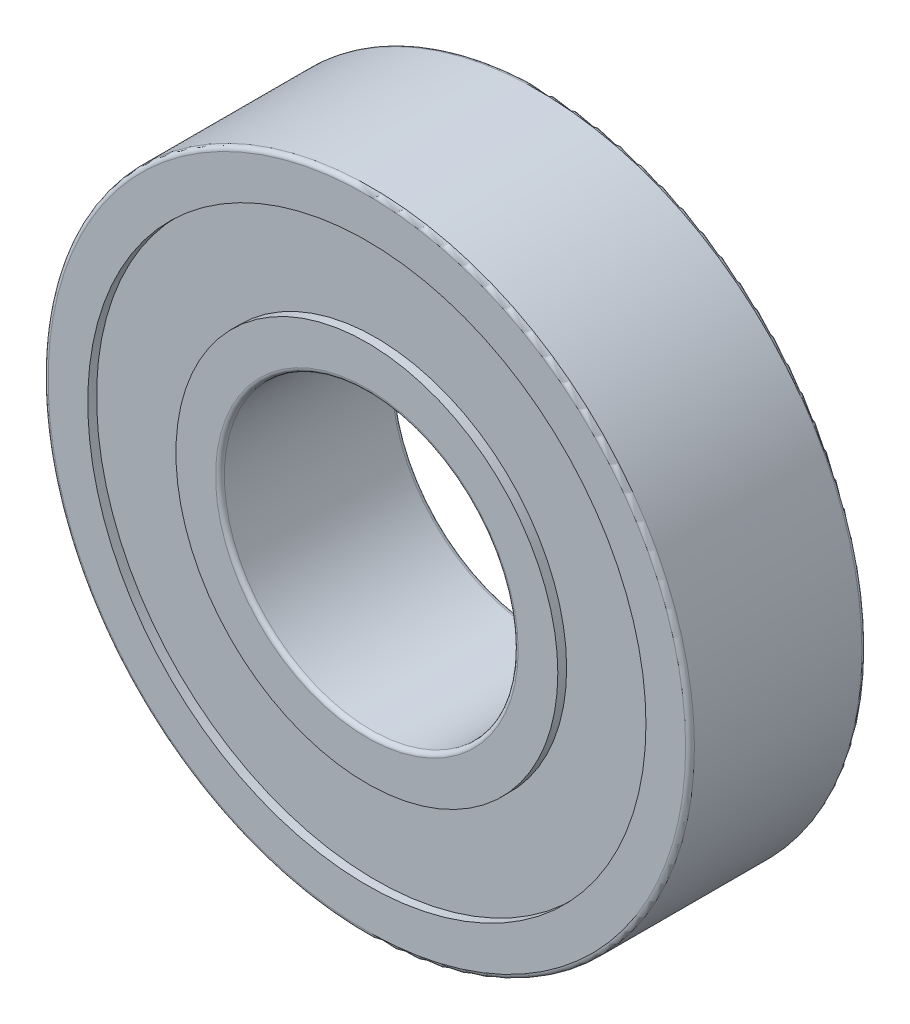
ISO-10303-21;
HEADER;
FILE_DESCRIPTION(('STEP AP214'),'2;1');
FILE_NAME('part.step','',(''),(''),'','','');
FILE_SCHEMA(('AUTOMOTIVE_DESIGN { 1 0 10303 214 1 1 1 1 }'));
ENDSEC;
DATA;
#1=APPLICATION_CONTEXT('core data for automotive mechanical design processes');
#2=APPLICATION_PROTOCOL_DEFINITION('international standard','automotive_design',2000,#1);
#3=PRODUCT_CONTEXT('',#1,'mechanical');
#4=PRODUCT('Part','Part','',(#3));
#5=PRODUCT_RELATED_PRODUCT_CATEGORY('part','',(#4));
#6=PRODUCT_DEFINITION_FORMATION('','',#4);
#7=PRODUCT_DEFINITION_CONTEXT('part definition',#1,'design');
#8=PRODUCT_DEFINITION('design','',#6,#7);
#9=PRODUCT_DEFINITION_SHAPE('','',#8);
#10=(LENGTH_UNIT() NAMED_UNIT(*) SI_UNIT(.MILLI.,.METRE.));
#11=(NAMED_UNIT(*) PLANE_ANGLE_UNIT() SI_UNIT($,.RADIAN.));
#12=(NAMED_UNIT(*) SI_UNIT($,.STERADIAN.) SOLID_ANGLE_UNIT());
#13=UNCERTAINTY_MEASURE_WITH_UNIT(LENGTH_MEASURE(1.E-05),#10,'distance_accuracy_value','');
#14=(GEOMETRIC_REPRESENTATION_CONTEXT(3) GLOBAL_UNCERTAINTY_ASSIGNED_CONTEXT((#13)) GLOBAL_UNIT_ASSIGNED_CONTEXT((#10,
#11,#12)) REPRESENTATION_CONTEXT('',''));
#15=CARTESIAN_POINT('',(0.,0.,0.));
#16=DIRECTION('',(0.,0.,1.));
#17=DIRECTION('',(1.,0.,0.));
#18=AXIS2_PLACEMENT_3D('',#15,#16,#17);
#19=CARTESIAN_POINT('',(0.,0.,0.));
#20=DIRECTION('',(0.,0.,1.));
#21=DIRECTION('',(1.,0.,0.));
#22=AXIS2_PLACEMENT_3D('',#19,#20,#21);
#23=PLANE('',#22);
#24=CARTESIAN_POINT('',(0.,0.,0.));
#25=DIRECTION('',(0.,0.,1.));
#26=DIRECTION('',(1.,0.,0.));
#27=AXIS2_PLACEMENT_3D('',#24,#25,#26);
#28=CIRCLE('',#27,5.15);
#29=CARTESIAN_POINT('',(5.15,0.,0.));
#30=VERTEX_POINT('',#29);
#31=EDGE_CURVE('E61',#30,#30,#28,.T.);
#32=ORIENTED_EDGE('',*,*,#31,.T.);
#33=EDGE_LOOP('',(#32));
#34=FACE_BOUND('',#33,.T.);
#35=CARTESIAN_POINT('',(0.,0.,0.));
#36=DIRECTION('',(0.,0.,1.));
#37=DIRECTION('',(1.,0.,0.));
#38=AXIS2_PLACEMENT_3D('',#35,#36,#37);
#39=CIRCLE('',#38,6.5);
#40=CARTESIAN_POINT('',(6.5,0.,0.));
#41=VERTEX_POINT('',#40);
#42=EDGE_CURVE('E83',#41,#41,#39,.T.);
#43=ORIENTED_EDGE('',*,*,#42,.F.);
#44=EDGE_LOOP('',(#43));
#45=FACE_BOUND('',#44,.T.);
#46=ADVANCED_FACE('F32',(#34,#45),#23,.F.);
#47=CARTESIAN_POINT('',(0.,0.,6.));
#48=DIRECTION('',(0.,0.,1.));
#49=DIRECTION('',(1.,0.,0.));
#50=AXIS2_PLACEMENT_3D('',#47,#48,#49);
#51=PLANE('',#50);
#52=CARTESIAN_POINT('',(0.,0.,6.));
#53=DIRECTION('',(0.,0.,1.));
#54=DIRECTION('',(1.,0.,0.));
#55=AXIS2_PLACEMENT_3D('',#52,#53,#54);
#56=CIRCLE('',#55,5.15);
#57=CARTESIAN_POINT('',(5.15,0.,6.));
#58=VERTEX_POINT('',#57);
#59=EDGE_CURVE('E39',#58,#58,#56,.F.);
#60=ORIENTED_EDGE('',*,*,#59,.T.);
#61=EDGE_LOOP('',(#60));
#62=FACE_BOUND('',#61,.T.);
#63=CARTESIAN_POINT('',(0.,0.,6.));
#64=DIRECTION('',(0.,0.,1.));
#65=DIRECTION('',(1.,0.,0.));
#66=AXIS2_PLACEMENT_3D('',#63,#64,#65);
#67=CIRCLE('',#66,6.5);
#68=CARTESIAN_POINT('',(6.5,0.,6.));
#69=VERTEX_POINT('',#68);
#70=EDGE_CURVE('E71',#69,#69,#67,.T.);
#71=ORIENTED_EDGE('',*,*,#70,.T.);
#72=EDGE_LOOP('',(#71));
#73=FACE_BOUND('',#72,.T.);
#74=ADVANCED_FACE('F100',(#62,#73),#51,.T.);
#75=CARTESIAN_POINT('',(0.,0.,6.));
#76=DIRECTION('',(0.,0.,1.));
#77=DIRECTION('',(1.,0.,0.));
#78=AXIS2_PLACEMENT_3D('',#75,#76,#77);
#79=CIRCLE('',#78,10.85);
#80=CARTESIAN_POINT('',(10.85,0.,6.));
#81=VERTEX_POINT('',#80);
#82=EDGE_CURVE('E10',#81,#81,#79,.T.);
#83=ORIENTED_EDGE('',*,*,#82,.T.);
#84=EDGE_LOOP('',(#83));
#85=FACE_BOUND('',#84,.T.);
#86=CARTESIAN_POINT('',(0.,0.,6.));
#87=DIRECTION('',(0.,0.,1.));
#88=DIRECTION('',(1.,0.,0.));
#89=AXIS2_PLACEMENT_3D('',#86,#87,#88);
#90=CIRCLE('',#89,9.5);
#91=CARTESIAN_POINT('',(9.5,0.,6.));
#92=VERTEX_POINT('',#91);
#93=EDGE_CURVE('E65',#92,#92,#90,.T.);
#94=ORIENTED_EDGE('',*,*,#93,.F.);
#95=EDGE_LOOP('',(#94));
#96=FACE_BOUND('',#95,.T.);
#97=ADVANCED_FACE('F107',(#85,#96),#51,.T.);
#98=CARTESIAN_POINT('',(0.,0.,0.));
#99=DIRECTION('',(0.,0.,1.));
#100=DIRECTION('',(1.,0.,0.));
#101=AXIS2_PLACEMENT_3D('',#98,#99,#100);
#102=CIRCLE('',#101,10.85);
#103=CARTESIAN_POINT('',(10.85,0.,0.));
#104=VERTEX_POINT('',#103);
#105=EDGE_CURVE('E43',#104,#104,#102,.F.);
#106=ORIENTED_EDGE('',*,*,#105,.T.);
#107=EDGE_LOOP('',(#106));
#108=FACE_BOUND('',#107,.T.);
#109=CARTESIAN_POINT('',(0.,0.,0.));
#110=DIRECTION('',(0.,0.,1.));
#111=DIRECTION('',(1.,0.,0.));
#112=AXIS2_PLACEMENT_3D('',#109,#110,#111);
#113=CIRCLE('',#112,9.5);
#114=CARTESIAN_POINT('',(9.5,0.,0.));
#115=VERTEX_POINT('',#114);
#116=EDGE_CURVE('E77',#115,#115,#113,.T.);
#117=ORIENTED_EDGE('',*,*,#116,.T.);
#118=EDGE_LOOP('',(#117));
#119=FACE_BOUND('',#118,.T.);
#120=ADVANCED_FACE('F103',(#108,#119),#23,.F.);
#121=CARTESIAN_POINT('',(0.,0.,6.));
#122=DIRECTION('',(0.,0.,-1.));
#123=DIRECTION('',(-1.,0.,0.));
#124=AXIS2_PLACEMENT_3D('',#121,#122,#123);
#125=CYLINDRICAL_SURFACE('',#124,11.);
#126=CARTESIAN_POINT('',(0.,0.,0.15));
#127=DIRECTION('',(0.,0.,1.));
#128=DIRECTION('',(1.,0.,0.));
#129=AXIS2_PLACEMENT_3D('',#126,#127,#128);
#130=CIRCLE('',#129,11.);
#131=CARTESIAN_POINT('',(11.,0.,0.15));
#132=VERTEX_POINT('',#131);
#133=EDGE_CURVE('E47',#132,#132,#130,.T.);
#134=ORIENTED_EDGE('',*,*,#133,.T.);
#135=EDGE_LOOP('',(#134));
#136=FACE_BOUND('',#135,.T.);
#137=CARTESIAN_POINT('',(0.,0.,5.85));
#138=DIRECTION('',(0.,0.,1.));
#139=DIRECTION('',(1.,0.,0.));
#140=AXIS2_PLACEMENT_3D('',#137,#138,#139);
#141=CIRCLE('',#140,11.);
#142=CARTESIAN_POINT('',(11.,0.,5.85));
#143=VERTEX_POINT('',#142);
#144=EDGE_CURVE('E52',#143,#143,#141,.F.);
#145=ORIENTED_EDGE('',*,*,#144,.T.);
#146=EDGE_LOOP('',(#145));
#147=FACE_BOUND('',#146,.T.);
#148=ADVANCED_FACE('F111',(#136,#147),#125,.T.);
#149=CARTESIAN_POINT('',(0.,0.,6.));
#150=DIRECTION('',(0.,0.,-1.));
#151=DIRECTION('',(-1.,0.,0.));
#152=AXIS2_PLACEMENT_3D('',#149,#150,#151);
#153=CYLINDRICAL_SURFACE('',#152,5.);
#154=CARTESIAN_POINT('',(0.,0.,0.15));
#155=DIRECTION('',(0.,0.,1.));
#156=DIRECTION('',(1.,0.,0.));
#157=AXIS2_PLACEMENT_3D('',#154,#155,#156);
#158=CIRCLE('',#157,5.);
#159=CARTESIAN_POINT('',(5.,0.,0.15));
#160=VERTEX_POINT('',#159);
#161=EDGE_CURVE('E55',#160,#160,#158,.F.);
#162=ORIENTED_EDGE('',*,*,#161,.T.);
#163=EDGE_LOOP('',(#162));
#164=FACE_BOUND('',#163,.T.);
#165=CARTESIAN_POINT('',(0.,0.,5.85));
#166=DIRECTION('',(0.,0.,1.));
#167=DIRECTION('',(1.,0.,0.));
#168=AXIS2_PLACEMENT_3D('',#165,#166,#167);
#169=CIRCLE('',#168,5.);
#170=CARTESIAN_POINT('',(5.,0.,5.85));
#171=VERTEX_POINT('',#170);
#172=EDGE_CURVE('E58',#171,#171,#169,.T.);
#173=ORIENTED_EDGE('',*,*,#172,.T.);
#174=EDGE_LOOP('',(#173));
#175=FACE_BOUND('',#174,.T.);
#176=ADVANCED_FACE('F117',(#164,#175),#153,.F.);
#177=CARTESIAN_POINT('',(0.,0.,5.7));
#178=DIRECTION('',(0.,0.,1.));
#179=DIRECTION('',(1.,0.,0.));
#180=AXIS2_PLACEMENT_3D('',#177,#178,#179);
#181=CYLINDRICAL_SURFACE('',#180,9.5);
#182=CARTESIAN_POINT('',(0.,0.,5.7));
#183=DIRECTION('',(0.,0.,1.));
#184=DIRECTION('',(1.,0.,0.));
#185=AXIS2_PLACEMENT_3D('',#182,#183,#184);
#186=CIRCLE('',#185,9.5);
#187=CARTESIAN_POINT('',(9.5,0.,5.7));
#188=VERTEX_POINT('',#187);
#189=EDGE_CURVE('E64',#188,#188,#186,.T.);
#190=ORIENTED_EDGE('',*,*,#189,.F.);
#191=EDGE_LOOP('',(#190));
#192=FACE_BOUND('',#191,.T.);
#193=ORIENTED_EDGE('',*,*,#93,.T.);
#194=EDGE_LOOP('',(#193));
#195=FACE_BOUND('',#194,.T.);
#196=ADVANCED_FACE('F139',(#192,#195),#181,.F.);
#197=CARTESIAN_POINT('',(0.,0.,5.7));
#198=DIRECTION('',(0.,0.,1.));
#199=DIRECTION('',(1.,0.,0.));
#200=AXIS2_PLACEMENT_3D('',#197,#198,#199);
#201=PLANE('',#200);
#202=CARTESIAN_POINT('',(0.,0.,5.7));
#203=DIRECTION('',(0.,0.,1.));
#204=DIRECTION('',(1.,0.,0.));
#205=AXIS2_PLACEMENT_3D('',#202,#203,#204);
#206=CIRCLE('',#205,6.5);
#207=CARTESIAN_POINT('',(6.5,0.,5.7));
#208=VERTEX_POINT('',#207);
#209=EDGE_CURVE('E68',#208,#208,#206,.T.);
#210=ORIENTED_EDGE('',*,*,#209,.F.);
#211=EDGE_LOOP('',(#210));
#212=FACE_BOUND('',#211,.T.);
#213=ORIENTED_EDGE('',*,*,#189,.T.);
#214=EDGE_LOOP('',(#213));
#215=FACE_BOUND('',#214,.T.);
#216=ADVANCED_FACE('F135',(#212,#215),#201,.T.);
#217=CARTESIAN_POINT('',(0.,0.,5.7));
#218=DIRECTION('',(0.,0.,1.));
#219=DIRECTION('',(1.,0.,0.));
#220=AXIS2_PLACEMENT_3D('',#217,#218,#219);
#221=CYLINDRICAL_SURFACE('',#220,6.5);
#222=ORIENTED_EDGE('',*,*,#209,.T.);
#223=EDGE_LOOP('',(#222));
#224=FACE_BOUND('',#223,.T.);
#225=ORIENTED_EDGE('',*,*,#70,.F.);
#226=EDGE_LOOP('',(#225));
#227=FACE_BOUND('',#226,.T.);
#228=ADVANCED_FACE('F129',(#224,#227),#221,.T.);
#229=CARTESIAN_POINT('',(0.,0.,0.5));
#230=DIRECTION('',(0.,0.,1.));
#231=DIRECTION('',(1.,0.,0.));
#232=AXIS2_PLACEMENT_3D('',#229,#230,#231);
#233=PLANE('',#232);
#234=CARTESIAN_POINT('',(0.,0.,0.5));
#235=DIRECTION('',(0.,0.,1.));
#236=DIRECTION('',(1.,0.,0.));
#237=AXIS2_PLACEMENT_3D('',#234,#235,#236);
#238=CIRCLE('',#237,9.5);
#239=CARTESIAN_POINT('',(9.5,0.,0.5));
#240=VERTEX_POINT('',#239);
#241=EDGE_CURVE('E74',#240,#240,#238,.T.);
#242=ORIENTED_EDGE('',*,*,#241,.F.);
#243=EDGE_LOOP('',(#242));
#244=FACE_BOUND('',#243,.T.);
#245=CARTESIAN_POINT('',(0.,0.,0.5));
#246=DIRECTION('',(0.,0.,1.));
#247=DIRECTION('',(1.,0.,0.));
#248=AXIS2_PLACEMENT_3D('',#245,#246,#247);
#249=CIRCLE('',#248,6.5);
#250=CARTESIAN_POINT('',(6.5,0.,0.5));
#251=VERTEX_POINT('',#250);
#252=EDGE_CURVE('E80',#251,#251,#249,.T.);
#253=ORIENTED_EDGE('',*,*,#252,.T.);
#254=EDGE_LOOP('',(#253));
#255=FACE_BOUND('',#254,.T.);
#256=ADVANCED_FACE('F89',(#244,#255),#233,.F.);
#257=CARTESIAN_POINT('',(0.,0.,0.5));
#258=DIRECTION('',(0.,0.,-1.));
#259=DIRECTION('',(-1.,0.,0.));
#260=AXIS2_PLACEMENT_3D('',#257,#258,#259);
#261=CYLINDRICAL_SURFACE('',#260,9.5);
#262=ORIENTED_EDGE('',*,*,#241,.T.);
#263=EDGE_LOOP('',(#262));
#264=FACE_BOUND('',#263,.T.);
#265=ORIENTED_EDGE('',*,*,#116,.F.);
#266=EDGE_LOOP('',(#265));
#267=FACE_BOUND('',#266,.T.);
#268=ADVANCED_FACE('F95',(#264,#267),#261,.F.);
#269=CARTESIAN_POINT('',(0.,0.,0.5));
#270=DIRECTION('',(0.,0.,-1.));
#271=DIRECTION('',(-1.,0.,0.));
#272=AXIS2_PLACEMENT_3D('',#269,#270,#271);
#273=CYLINDRICAL_SURFACE('',#272,6.5);
#274=ORIENTED_EDGE('',*,*,#252,.F.);
#275=EDGE_LOOP('',(#274));
#276=FACE_BOUND('',#275,.T.);
#277=ORIENTED_EDGE('',*,*,#42,.T.);
#278=EDGE_LOOP('',(#277));
#279=FACE_BOUND('',#278,.T.);
#280=ADVANCED_FACE('F91',(#276,#279),#273,.T.);
#281=CARTESIAN_POINT('',(0.,0.,0.15));
#282=DIRECTION('',(0.,0.,1.));
#283=DIRECTION('',(1.,0.,0.));
#284=AXIS2_PLACEMENT_3D('',#281,#282,#283);
#285=TOROIDAL_SURFACE('',#284,5.15,0.15);
#286=ORIENTED_EDGE('',*,*,#161,.F.);
#287=EDGE_LOOP('',(#286));
#288=FACE_BOUND('',#287,.T.);
#289=ORIENTED_EDGE('',*,*,#31,.F.);
#290=EDGE_LOOP('',(#289));
#291=FACE_BOUND('',#290,.T.);
#292=ADVANCED_FACE('F94',(#288,#291),#285,.T.);
#293=CARTESIAN_POINT('',(0.,0.,0.15));
#294=DIRECTION('',(0.,0.,1.));
#295=DIRECTION('',(1.,0.,0.));
#296=AXIS2_PLACEMENT_3D('',#293,#294,#295);
#297=TOROIDAL_SURFACE('',#296,10.85,0.15);
#298=ORIENTED_EDGE('',*,*,#105,.F.);
#299=EDGE_LOOP('',(#298));
#300=FACE_BOUND('',#299,.T.);
#301=ORIENTED_EDGE('',*,*,#133,.F.);
#302=EDGE_LOOP('',(#301));
#303=FACE_BOUND('',#302,.T.);
#304=ADVANCED_FACE('F154',(#300,#303),#297,.T.);
#305=CARTESIAN_POINT('',(0.,0.,5.85));
#306=DIRECTION('',(0.,0.,1.));
#307=DIRECTION('',(1.,0.,0.));
#308=AXIS2_PLACEMENT_3D('',#305,#306,#307);
#309=TOROIDAL_SURFACE('',#308,5.15,0.15);
#310=ORIENTED_EDGE('',*,*,#59,.F.);
#311=EDGE_LOOP('',(#310));
#312=FACE_BOUND('',#311,.T.);
#313=ORIENTED_EDGE('',*,*,#172,.F.);
#314=EDGE_LOOP('',(#313));
#315=FACE_BOUND('',#314,.T.);
#316=ADVANCED_FACE('F152',(#312,#315),#309,.T.);
#317=CARTESIAN_POINT('',(0.,0.,5.85));
#318=DIRECTION('',(0.,0.,1.));
#319=DIRECTION('',(1.,0.,0.));
#320=AXIS2_PLACEMENT_3D('',#317,#318,#319);
#321=TOROIDAL_SURFACE('',#320,10.85,0.15);
#322=ORIENTED_EDGE('',*,*,#144,.F.);
#323=EDGE_LOOP('',(#322));
#324=FACE_BOUND('',#323,.T.);
#325=ORIENTED_EDGE('',*,*,#82,.F.);
#326=EDGE_LOOP('',(#325));
#327=FACE_BOUND('',#326,.T.);
#328=ADVANCED_FACE('F34',(#324,#327),#321,.T.);
#329=CLOSED_SHELL('',(#46,#74,#97,#120,#148,#176,#196,#216,#228,#256,#268,#280,#292,#304,#316,#328));
#330=MANIFOLD_SOLID_BREP('B2',#329);
#331=ADVANCED_BREP_SHAPE_REPRESENTATION('',(#18,#330),#14);
#332=SHAPE_DEFINITION_REPRESENTATION(#9,#331);
ENDSEC;
END-ISO-10303-21;
